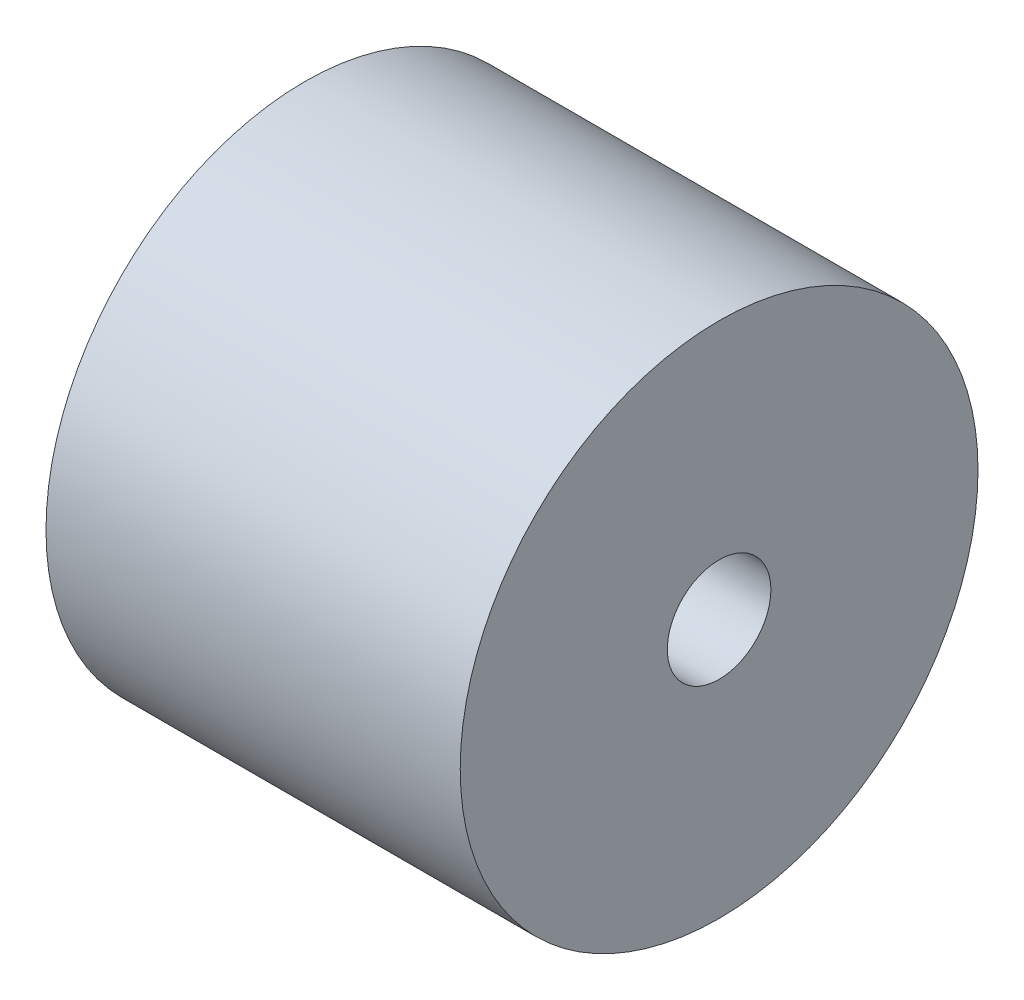
ISO-10303-21;
HEADER;
FILE_DESCRIPTION(('STEP AP214'),'2;1');
FILE_NAME('part.step','',(''),(''),'','','');
FILE_SCHEMA(('AUTOMOTIVE_DESIGN { 1 0 10303 214 1 1 1 1 }'));
ENDSEC;
DATA;
#1=APPLICATION_CONTEXT('core data for automotive mechanical design processes');
#2=APPLICATION_PROTOCOL_DEFINITION('international standard','automotive_design',2000,#1);
#3=PRODUCT_CONTEXT('',#1,'mechanical');
#4=PRODUCT('Part','Part','',(#3));
#5=PRODUCT_RELATED_PRODUCT_CATEGORY('part','',(#4));
#6=PRODUCT_DEFINITION_FORMATION('','',#4);
#7=PRODUCT_DEFINITION_CONTEXT('part definition',#1,'design');
#8=PRODUCT_DEFINITION('design','',#6,#7);
#9=PRODUCT_DEFINITION_SHAPE('','',#8);
#10=(LENGTH_UNIT() NAMED_UNIT(*) SI_UNIT(.MILLI.,.METRE.));
#11=(NAMED_UNIT(*) PLANE_ANGLE_UNIT() SI_UNIT($,.RADIAN.));
#12=(NAMED_UNIT(*) SI_UNIT($,.STERADIAN.) SOLID_ANGLE_UNIT());
#13=UNCERTAINTY_MEASURE_WITH_UNIT(LENGTH_MEASURE(1.E-05),#10,'distance_accuracy_value','');
#14=(GEOMETRIC_REPRESENTATION_CONTEXT(3) GLOBAL_UNCERTAINTY_ASSIGNED_CONTEXT((#13)) GLOBAL_UNIT_ASSIGNED_CONTEXT((#10,
#11,#12)) REPRESENTATION_CONTEXT('',''));
#15=CARTESIAN_POINT('',(0.,0.,0.));
#16=DIRECTION('',(0.,0.,1.));
#17=DIRECTION('',(1.,0.,0.));
#18=AXIS2_PLACEMENT_3D('',#15,#16,#17);
#19=CARTESIAN_POINT('',(16.,0.,0.));
#20=DIRECTION('',(-1.,0.,0.));
#21=DIRECTION('',(0.,0.,1.));
#22=AXIS2_PLACEMENT_3D('',#19,#20,#21);
#23=CYLINDRICAL_SURFACE('',#22,10.);
#24=CARTESIAN_POINT('',(16.,0.,0.));
#25=DIRECTION('',(1.,0.,0.));
#26=DIRECTION('',(0.,0.,-1.));
#27=AXIS2_PLACEMENT_3D('',#24,#25,#26);
#28=CIRCLE('',#27,10.);
#29=CARTESIAN_POINT('',(16.,0.,-10.));
#30=VERTEX_POINT('',#29);
#31=EDGE_CURVE('E10',#30,#30,#28,.T.);
#32=ORIENTED_EDGE('',*,*,#31,.F.);
#33=EDGE_LOOP('',(#32));
#34=FACE_BOUND('',#33,.T.);
#35=CARTESIAN_POINT('',(0.,0.,0.));
#36=DIRECTION('',(1.,0.,0.));
#37=DIRECTION('',(0.,0.,-1.));
#38=AXIS2_PLACEMENT_3D('',#35,#36,#37);
#39=CIRCLE('',#38,10.);
#40=CARTESIAN_POINT('',(0.,0.,-10.));
#41=VERTEX_POINT('',#40);
#42=EDGE_CURVE('E37',#41,#41,#39,.T.);
#43=ORIENTED_EDGE('',*,*,#42,.T.);
#44=EDGE_LOOP('',(#43));
#45=FACE_BOUND('',#44,.T.);
#46=ADVANCED_FACE('F34',(#34,#45),#23,.T.);
#47=CARTESIAN_POINT('',(16.,0.,0.));
#48=DIRECTION('',(1.,0.,0.));
#49=DIRECTION('',(0.,0.,-1.));
#50=AXIS2_PLACEMENT_3D('',#47,#48,#49);
#51=PLANE('',#50);
#52=CARTESIAN_POINT('',(16.,0.,0.));
#53=DIRECTION('',(1.,0.,0.));
#54=DIRECTION('',(0.,0.,-1.));
#55=AXIS2_PLACEMENT_3D('',#52,#53,#54);
#56=CIRCLE('',#55,2.);
#57=CARTESIAN_POINT('',(16.,0.,-2.));
#58=VERTEX_POINT('',#57);
#59=EDGE_CURVE('E46',#58,#58,#56,.T.);
#60=ORIENTED_EDGE('',*,*,#59,.F.);
#61=EDGE_LOOP('',(#60));
#62=FACE_BOUND('',#61,.T.);
#63=ORIENTED_EDGE('',*,*,#31,.T.);
#64=EDGE_LOOP('',(#63));
#65=FACE_BOUND('',#64,.T.);
#66=ADVANCED_FACE('F89',(#62,#65),#51,.T.);
#67=CARTESIAN_POINT('',(0.,0.,0.));
#68=DIRECTION('',(1.,0.,0.));
#69=DIRECTION('',(0.,0.,-1.));
#70=AXIS2_PLACEMENT_3D('',#67,#68,#69);
#71=PLANE('',#70);
#72=CARTESIAN_POINT('',(0.,0.,0.));
#73=DIRECTION('',(-1.,0.,0.));
#74=DIRECTION('',(0.,0.,1.));
#75=AXIS2_PLACEMENT_3D('',#72,#73,#74);
#76=CIRCLE('',#75,8.4);
#77=CARTESIAN_POINT('',(0.,0.,8.4));
#78=VERTEX_POINT('',#77);
#79=EDGE_CURVE('E52',#78,#78,#76,.T.);
#80=ORIENTED_EDGE('',*,*,#79,.F.);
#81=EDGE_LOOP('',(#80));
#82=FACE_BOUND('',#81,.T.);
#83=ORIENTED_EDGE('',*,*,#42,.F.);
#84=EDGE_LOOP('',(#83));
#85=FACE_BOUND('',#84,.T.);
#86=ADVANCED_FACE('F85',(#82,#85),#71,.F.);
#87=CARTESIAN_POINT('',(6.00000000000001,0.,0.));
#88=DIRECTION('',(1.,0.,0.));
#89=DIRECTION('',(0.,0.,-1.));
#90=AXIS2_PLACEMENT_3D('',#87,#88,#89);
#91=CYLINDRICAL_SURFACE('',#90,2.);
#92=CARTESIAN_POINT('',(6.00000000000001,0.,0.));
#93=DIRECTION('',(1.,0.,0.));
#94=DIRECTION('',(0.,0.,-1.));
#95=AXIS2_PLACEMENT_3D('',#92,#93,#94);
#96=CIRCLE('',#95,2.);
#97=CARTESIAN_POINT('',(6.00000000000001,0.,-2.));
#98=VERTEX_POINT('',#97);
#99=EDGE_CURVE('E44',#98,#98,#96,.T.);
#100=ORIENTED_EDGE('',*,*,#99,.F.);
#101=EDGE_LOOP('',(#100));
#102=FACE_BOUND('',#101,.T.);
#103=ORIENTED_EDGE('',*,*,#59,.T.);
#104=EDGE_LOOP('',(#103));
#105=FACE_BOUND('',#104,.T.);
#106=ADVANCED_FACE('F88',(#102,#105),#91,.F.);
#107=CARTESIAN_POINT('',(6.00000000000001,0.,0.));
#108=DIRECTION('',(1.,0.,0.));
#109=DIRECTION('',(0.,0.,-1.));
#110=AXIS2_PLACEMENT_3D('',#107,#108,#109);
#111=PLANE('',#110);
#112=ORIENTED_EDGE('',*,*,#99,.T.);
#113=EDGE_LOOP('',(#112));
#114=FACE_BOUND('',#113,.T.);
#115=ADVANCED_FACE('F81',(#114),#111,.T.);
#116=CARTESIAN_POINT('',(1.,0.,0.));
#117=DIRECTION('',(-1.,0.,0.));
#118=DIRECTION('',(0.,0.,1.));
#119=AXIS2_PLACEMENT_3D('',#116,#117,#118);
#120=CYLINDRICAL_SURFACE('',#119,8.4);
#121=CARTESIAN_POINT('',(1.,0.,0.));
#122=DIRECTION('',(-1.,0.,0.));
#123=DIRECTION('',(0.,0.,1.));
#124=AXIS2_PLACEMENT_3D('',#121,#122,#123);
#125=CIRCLE('',#124,8.4);
#126=CARTESIAN_POINT('',(1.,0.,8.4));
#127=VERTEX_POINT('',#126);
#128=EDGE_CURVE('E49',#127,#127,#125,.T.);
#129=ORIENTED_EDGE('',*,*,#128,.F.);
#130=EDGE_LOOP('',(#129));
#131=FACE_BOUND('',#130,.T.);
#132=ORIENTED_EDGE('',*,*,#79,.T.);
#133=EDGE_LOOP('',(#132));
#134=FACE_BOUND('',#133,.T.);
#135=ADVANCED_FACE('F75',(#131,#134),#120,.F.);
#136=CARTESIAN_POINT('',(1.,0.,0.));
#137=DIRECTION('',(-1.,0.,0.));
#138=DIRECTION('',(0.,0.,1.));
#139=AXIS2_PLACEMENT_3D('',#136,#137,#138);
#140=PLANE('',#139);
#141=CARTESIAN_POINT('',(1.,0.,0.));
#142=DIRECTION('',(-1.,0.,0.));
#143=DIRECTION('',(0.,0.,1.));
#144=AXIS2_PLACEMENT_3D('',#141,#142,#143);
#145=CIRCLE('',#144,3.93);
#146=CARTESIAN_POINT('',(1.,0.,3.93));
#147=VERTEX_POINT('',#146);
#148=EDGE_CURVE('E58',#147,#147,#145,.T.);
#149=ORIENTED_EDGE('',*,*,#148,.F.);
#150=EDGE_LOOP('',(#149));
#151=FACE_BOUND('',#150,.T.);
#152=ORIENTED_EDGE('',*,*,#128,.T.);
#153=EDGE_LOOP('',(#152));
#154=FACE_BOUND('',#153,.T.);
#155=ADVANCED_FACE('F69',(#151,#154),#140,.T.);
#156=CARTESIAN_POINT('',(0.,0.,0.));
#157=DIRECTION('',(1.,0.,0.));
#158=DIRECTION('',(0.,0.,-1.));
#159=AXIS2_PLACEMENT_3D('',#156,#157,#158);
#160=CYLINDRICAL_SURFACE('',#159,3.93);
#161=CARTESIAN_POINT('',(0.,0.,0.));
#162=DIRECTION('',(-1.,0.,0.));
#163=DIRECTION('',(0.,0.,1.));
#164=AXIS2_PLACEMENT_3D('',#161,#162,#163);
#165=CIRCLE('',#164,3.93);
#166=CARTESIAN_POINT('',(0.,0.,3.93));
#167=VERTEX_POINT('',#166);
#168=EDGE_CURVE('E55',#167,#167,#165,.T.);
#169=ORIENTED_EDGE('',*,*,#168,.F.);
#170=EDGE_LOOP('',(#169));
#171=FACE_BOUND('',#170,.T.);
#172=ORIENTED_EDGE('',*,*,#148,.T.);
#173=EDGE_LOOP('',(#172));
#174=FACE_BOUND('',#173,.T.);
#175=ADVANCED_FACE('F66',(#171,#174),#160,.T.);
#176=CARTESIAN_POINT('',(0.,0.,0.));
#177=DIRECTION('',(-1.,0.,0.));
#178=DIRECTION('',(0.,0.,1.));
#179=AXIS2_PLACEMENT_3D('',#176,#177,#178);
#180=PLANE('',#179);
#181=ORIENTED_EDGE('',*,*,#168,.T.);
#182=EDGE_LOOP('',(#181));
#183=FACE_BOUND('',#182,.T.);
#184=ADVANCED_FACE('F64',(#183),#180,.T.);
#185=CLOSED_SHELL('',(#46,#66,#86,#106,#115,#135,#155,#175,#184));
#186=MANIFOLD_SOLID_BREP('B2',#185);
#187=ADVANCED_BREP_SHAPE_REPRESENTATION('',(#18,#186),#14);
#188=SHAPE_DEFINITION_REPRESENTATION(#9,#187);
ENDSEC;
END-ISO-10303-21;
